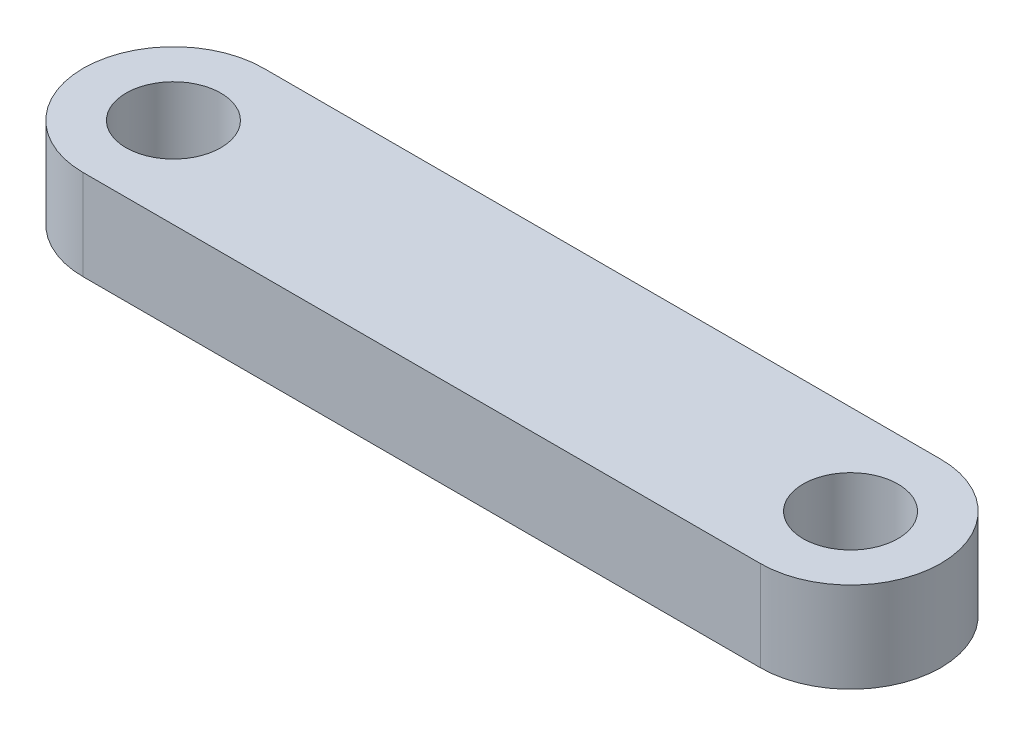
ISO-10303-21;
HEADER;
FILE_DESCRIPTION(('STEP AP214'),'2;1');
FILE_NAME('part.step','',(''),(''),'','','');
FILE_SCHEMA(('AUTOMOTIVE_DESIGN { 1 0 10303 214 1 1 1 1 }'));
ENDSEC;
DATA;
#1=APPLICATION_CONTEXT('core data for automotive mechanical design processes');
#2=APPLICATION_PROTOCOL_DEFINITION('international standard','automotive_design',2000,#1);
#3=PRODUCT_CONTEXT('',#1,'mechanical');
#4=PRODUCT('Part','Part','',(#3));
#5=PRODUCT_RELATED_PRODUCT_CATEGORY('part','',(#4));
#6=PRODUCT_DEFINITION_FORMATION('','',#4);
#7=PRODUCT_DEFINITION_CONTEXT('part definition',#1,'design');
#8=PRODUCT_DEFINITION('design','',#6,#7);
#9=PRODUCT_DEFINITION_SHAPE('','',#8);
#10=(LENGTH_UNIT() NAMED_UNIT(*) SI_UNIT(.MILLI.,.METRE.));
#11=(NAMED_UNIT(*) PLANE_ANGLE_UNIT() SI_UNIT($,.RADIAN.));
#12=(NAMED_UNIT(*) SI_UNIT($,.STERADIAN.) SOLID_ANGLE_UNIT());
#13=UNCERTAINTY_MEASURE_WITH_UNIT(LENGTH_MEASURE(1.E-05),#10,'distance_accuracy_value','');
#14=(GEOMETRIC_REPRESENTATION_CONTEXT(3) GLOBAL_UNCERTAINTY_ASSIGNED_CONTEXT((#13)) GLOBAL_UNIT_ASSIGNED_CONTEXT((#10,
#11,#12)) REPRESENTATION_CONTEXT('',''));
#15=CARTESIAN_POINT('',(0.,0.,0.));
#16=DIRECTION('',(0.,0.,1.));
#17=DIRECTION('',(1.,0.,0.));
#18=AXIS2_PLACEMENT_3D('',#15,#16,#17);
#19=CARTESIAN_POINT('',(0.,2.,0.));
#20=DIRECTION('',(0.,1.,0.));
#21=DIRECTION('',(0.,0.,1.));
#22=AXIS2_PLACEMENT_3D('',#19,#20,#21);
#23=PLANE('',#22);
#24=CARTESIAN_POINT('',(0.,2.,0.));
#25=DIRECTION('',(0.,1.,0.));
#26=DIRECTION('',(0.,0.,1.));
#27=AXIS2_PLACEMENT_3D('',#24,#25,#26);
#28=CIRCLE('',#27,1.05);
#29=CARTESIAN_POINT('',(0.,2.,1.05));
#30=VERTEX_POINT('',#29);
#31=EDGE_CURVE('E116',#30,#30,#28,.T.);
#32=ORIENTED_EDGE('',*,*,#31,.F.);
#33=EDGE_LOOP('',(#32));
#34=FACE_BOUND('',#33,.T.);
#35=CARTESIAN_POINT('',(0.,2.,0.));
#36=DIRECTION('',(0.,1.,0.));
#37=DIRECTION('',(0.,0.,1.));
#38=AXIS2_PLACEMENT_3D('',#35,#36,#37);
#39=CIRCLE('',#38,2.);
#40=CARTESIAN_POINT('',(0.,2.,-2.));
#41=VERTEX_POINT('',#40);
#42=CARTESIAN_POINT('',(0.,2.,2.));
#43=VERTEX_POINT('',#42);
#44=EDGE_CURVE('E96',#41,#43,#39,.T.);
#45=ORIENTED_EDGE('',*,*,#44,.T.);
#46=DIRECTION('',(1.,0.,0.));
#47=VECTOR('',#46,1.);
#48=CARTESIAN_POINT('',(0.,2.,2.));
#49=LINE('',#48,#47);
#50=CARTESIAN_POINT('',(15.,2.,2.));
#51=VERTEX_POINT('',#50);
#52=EDGE_CURVE('E91',#43,#51,#49,.T.);
#53=ORIENTED_EDGE('',*,*,#52,.T.);
#54=CARTESIAN_POINT('',(15.,2.,0.));
#55=DIRECTION('',(0.,1.,0.));
#56=DIRECTION('',(0.,0.,1.));
#57=AXIS2_PLACEMENT_3D('',#54,#55,#56);
#58=CIRCLE('',#57,2.);
#59=CARTESIAN_POINT('',(15.,2.,-2.));
#60=VERTEX_POINT('',#59);
#61=EDGE_CURVE('E94',#51,#60,#58,.T.);
#62=ORIENTED_EDGE('',*,*,#61,.T.);
#63=DIRECTION('',(-1.,0.,0.));
#64=VECTOR('',#63,1.);
#65=CARTESIAN_POINT('',(0.,2.,-2.));
#66=LINE('',#65,#64);
#67=EDGE_CURVE('E61',#60,#41,#66,.T.);
#68=ORIENTED_EDGE('',*,*,#67,.T.);
#69=EDGE_LOOP('',(#45,#53,#62,#68));
#70=FACE_BOUND('',#69,.T.);
#71=CARTESIAN_POINT('',(15.,2.,0.));
#72=DIRECTION('',(0.,1.,0.));
#73=DIRECTION('',(0.,0.,1.));
#74=AXIS2_PLACEMENT_3D('',#71,#72,#73);
#75=CIRCLE('',#74,1.04999999999999);
#76=CARTESIAN_POINT('',(15.,2.,1.04999999999999));
#77=VERTEX_POINT('',#76);
#78=EDGE_CURVE('E138',#77,#77,#75,.T.);
#79=ORIENTED_EDGE('',*,*,#78,.F.);
#80=EDGE_LOOP('',(#79));
#81=FACE_BOUND('',#80,.T.);
#82=ADVANCED_FACE('F43',(#34,#70,#81),#23,.T.);
#83=CARTESIAN_POINT('',(0.,0.,0.));
#84=DIRECTION('',(0.,1.,0.));
#85=DIRECTION('',(0.,0.,1.));
#86=AXIS2_PLACEMENT_3D('',#83,#84,#85);
#87=PLANE('',#86);
#88=CARTESIAN_POINT('',(0.,0.,0.));
#89=DIRECTION('',(0.,1.,0.));
#90=DIRECTION('',(0.,0.,1.));
#91=AXIS2_PLACEMENT_3D('',#88,#89,#90);
#92=CIRCLE('',#91,2.);
#93=CARTESIAN_POINT('',(0.,0.,-2.));
#94=VERTEX_POINT('',#93);
#95=CARTESIAN_POINT('',(0.,0.,2.));
#96=VERTEX_POINT('',#95);
#97=EDGE_CURVE('E112',#94,#96,#92,.T.);
#98=ORIENTED_EDGE('',*,*,#97,.F.);
#99=DIRECTION('',(-1.,0.,0.));
#100=VECTOR('',#99,1.);
#101=CARTESIAN_POINT('',(0.,0.,-2.));
#102=LINE('',#101,#100);
#103=CARTESIAN_POINT('',(15.,0.,-2.));
#104=VERTEX_POINT('',#103);
#105=EDGE_CURVE('E84',#104,#94,#102,.T.);
#106=ORIENTED_EDGE('',*,*,#105,.F.);
#107=CARTESIAN_POINT('',(15.,0.,0.));
#108=DIRECTION('',(0.,1.,0.));
#109=DIRECTION('',(0.,0.,1.));
#110=AXIS2_PLACEMENT_3D('',#107,#108,#109);
#111=CIRCLE('',#110,2.);
#112=CARTESIAN_POINT('',(15.,0.,2.));
#113=VERTEX_POINT('',#112);
#114=EDGE_CURVE('E78',#113,#104,#111,.T.);
#115=ORIENTED_EDGE('',*,*,#114,.F.);
#116=DIRECTION('',(1.,0.,0.));
#117=VECTOR('',#116,1.);
#118=CARTESIAN_POINT('',(0.,0.,2.));
#119=LINE('',#118,#117);
#120=EDGE_CURVE('E101',#96,#113,#119,.T.);
#121=ORIENTED_EDGE('',*,*,#120,.F.);
#122=EDGE_LOOP('',(#98,#106,#115,#121));
#123=FACE_BOUND('',#122,.T.);
#124=CARTESIAN_POINT('',(0.,0.,0.));
#125=DIRECTION('',(0.,1.,0.));
#126=DIRECTION('',(0.,0.,1.));
#127=AXIS2_PLACEMENT_3D('',#124,#125,#126);
#128=CIRCLE('',#127,1.05);
#129=CARTESIAN_POINT('',(0.,0.,1.05));
#130=VERTEX_POINT('',#129);
#131=EDGE_CURVE('E134',#130,#130,#128,.T.);
#132=ORIENTED_EDGE('',*,*,#131,.T.);
#133=EDGE_LOOP('',(#132));
#134=FACE_BOUND('',#133,.T.);
#135=CARTESIAN_POINT('',(15.,0.,0.));
#136=DIRECTION('',(0.,1.,0.));
#137=DIRECTION('',(0.,0.,1.));
#138=AXIS2_PLACEMENT_3D('',#135,#136,#137);
#139=CIRCLE('',#138,1.04999999999999);
#140=CARTESIAN_POINT('',(15.,0.,1.04999999999999));
#141=VERTEX_POINT('',#140);
#142=EDGE_CURVE('E142',#141,#141,#139,.T.);
#143=ORIENTED_EDGE('',*,*,#142,.T.);
#144=EDGE_LOOP('',(#143));
#145=FACE_BOUND('',#144,.T.);
#146=ADVANCED_FACE('F129',(#123,#134,#145),#87,.F.);
#147=CARTESIAN_POINT('',(0.,2.,0.));
#148=DIRECTION('',(0.,-1.,0.));
#149=DIRECTION('',(0.,0.,-1.));
#150=AXIS2_PLACEMENT_3D('',#147,#148,#149);
#151=CYLINDRICAL_SURFACE('',#150,2.);
#152=ORIENTED_EDGE('',*,*,#97,.T.);
#153=DIRECTION('',(0.,-1.,0.));
#154=VECTOR('',#153,1.);
#155=CARTESIAN_POINT('',(0.,2.,2.));
#156=LINE('',#155,#154);
#157=EDGE_CURVE('E11',#43,#96,#156,.T.);
#158=ORIENTED_EDGE('',*,*,#157,.F.);
#159=ORIENTED_EDGE('',*,*,#44,.F.);
#160=DIRECTION('',(0.,-1.,0.));
#161=VECTOR('',#160,1.);
#162=CARTESIAN_POINT('',(0.,2.,-2.));
#163=LINE('',#162,#161);
#164=EDGE_CURVE('E108',#41,#94,#163,.T.);
#165=ORIENTED_EDGE('',*,*,#164,.T.);
#166=EDGE_LOOP('',(#152,#158,#159,#165));
#167=FACE_BOUND('',#166,.T.);
#168=ADVANCED_FACE('F45',(#167),#151,.T.);
#169=CARTESIAN_POINT('',(0.,2.,2.));
#170=DIRECTION('',(0.,0.,-1.));
#171=DIRECTION('',(-1.,0.,0.));
#172=AXIS2_PLACEMENT_3D('',#169,#170,#171);
#173=PLANE('',#172);
#174=ORIENTED_EDGE('',*,*,#120,.T.);
#175=DIRECTION('',(0.,-1.,0.));
#176=VECTOR('',#175,1.);
#177=CARTESIAN_POINT('',(15.,2.,2.));
#178=LINE('',#177,#176);
#179=EDGE_CURVE('E53',#51,#113,#178,.T.);
#180=ORIENTED_EDGE('',*,*,#179,.F.);
#181=ORIENTED_EDGE('',*,*,#52,.F.);
#182=ORIENTED_EDGE('',*,*,#157,.T.);
#183=EDGE_LOOP('',(#174,#180,#181,#182));
#184=FACE_BOUND('',#183,.T.);
#185=ADVANCED_FACE('F100',(#184),#173,.F.);
#186=CARTESIAN_POINT('',(15.,2.,0.));
#187=DIRECTION('',(0.,-1.,0.));
#188=DIRECTION('',(0.,0.,-1.));
#189=AXIS2_PLACEMENT_3D('',#186,#187,#188);
#190=CYLINDRICAL_SURFACE('',#189,2.);
#191=ORIENTED_EDGE('',*,*,#114,.T.);
#192=DIRECTION('',(0.,-1.,0.));
#193=VECTOR('',#192,1.);
#194=CARTESIAN_POINT('',(15.,2.,-2.));
#195=LINE('',#194,#193);
#196=EDGE_CURVE('E103',#60,#104,#195,.T.);
#197=ORIENTED_EDGE('',*,*,#196,.F.);
#198=ORIENTED_EDGE('',*,*,#61,.F.);
#199=ORIENTED_EDGE('',*,*,#179,.T.);
#200=EDGE_LOOP('',(#191,#197,#198,#199));
#201=FACE_BOUND('',#200,.T.);
#202=ADVANCED_FACE('F104',(#201),#190,.T.);
#203=CARTESIAN_POINT('',(0.,2.,-2.));
#204=DIRECTION('',(0.,0.,1.));
#205=DIRECTION('',(1.,0.,0.));
#206=AXIS2_PLACEMENT_3D('',#203,#204,#205);
#207=PLANE('',#206);
#208=ORIENTED_EDGE('',*,*,#105,.T.);
#209=ORIENTED_EDGE('',*,*,#164,.F.);
#210=ORIENTED_EDGE('',*,*,#67,.F.);
#211=ORIENTED_EDGE('',*,*,#196,.T.);
#212=EDGE_LOOP('',(#208,#209,#210,#211));
#213=FACE_BOUND('',#212,.T.);
#214=ADVANCED_FACE('F126',(#213),#207,.F.);
#215=CARTESIAN_POINT('',(0.,2.,0.));
#216=DIRECTION('',(0.,-1.,0.));
#217=DIRECTION('',(0.,0.,-1.));
#218=AXIS2_PLACEMENT_3D('',#215,#216,#217);
#219=CYLINDRICAL_SURFACE('',#218,1.05);
#220=ORIENTED_EDGE('',*,*,#31,.T.);
#221=EDGE_LOOP('',(#220));
#222=FACE_BOUND('',#221,.T.);
#223=ORIENTED_EDGE('',*,*,#131,.F.);
#224=EDGE_LOOP('',(#223));
#225=FACE_BOUND('',#224,.T.);
#226=ADVANCED_FACE('F161',(#222,#225),#219,.F.);
#227=CARTESIAN_POINT('',(15.,2.,0.));
#228=DIRECTION('',(0.,-1.,0.));
#229=DIRECTION('',(0.,0.,-1.));
#230=AXIS2_PLACEMENT_3D('',#227,#228,#229);
#231=CYLINDRICAL_SURFACE('',#230,1.04999999999999);
#232=ORIENTED_EDGE('',*,*,#78,.T.);
#233=EDGE_LOOP('',(#232));
#234=FACE_BOUND('',#233,.T.);
#235=ORIENTED_EDGE('',*,*,#142,.F.);
#236=EDGE_LOOP('',(#235));
#237=FACE_BOUND('',#236,.T.);
#238=ADVANCED_FACE('F150',(#234,#237),#231,.F.);
#239=CLOSED_SHELL('',(#82,#146,#168,#185,#202,#214,#226,#238));
#240=MANIFOLD_SOLID_BREP('B2',#239);
#241=ADVANCED_BREP_SHAPE_REPRESENTATION('',(#18,#240),#14);
#242=SHAPE_DEFINITION_REPRESENTATION(#9,#241);
ENDSEC;
END-ISO-10303-21;
